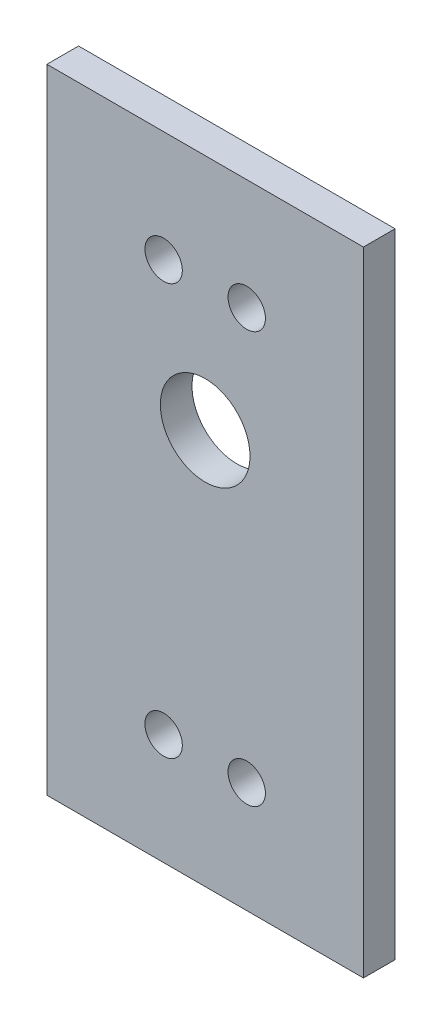
ISO-10303-21;
HEADER;
FILE_DESCRIPTION(('STEP AP214'),'2;1');
FILE_NAME('part.step','',(''),(''),'','','');
FILE_SCHEMA(('AUTOMOTIVE_DESIGN { 1 0 10303 214 1 1 1 1 }'));
ENDSEC;
DATA;
#1=APPLICATION_CONTEXT('core data for automotive mechanical design processes');
#2=APPLICATION_PROTOCOL_DEFINITION('international standard','automotive_design',2000,#1);
#3=PRODUCT_CONTEXT('',#1,'mechanical');
#4=PRODUCT('Part','Part','',(#3));
#5=PRODUCT_RELATED_PRODUCT_CATEGORY('part','',(#4));
#6=PRODUCT_DEFINITION_FORMATION('','',#4);
#7=PRODUCT_DEFINITION_CONTEXT('part definition',#1,'design');
#8=PRODUCT_DEFINITION('design','',#6,#7);
#9=PRODUCT_DEFINITION_SHAPE('','',#8);
#10=(LENGTH_UNIT() NAMED_UNIT(*) SI_UNIT(.MILLI.,.METRE.));
#11=(NAMED_UNIT(*) PLANE_ANGLE_UNIT() SI_UNIT($,.RADIAN.));
#12=(NAMED_UNIT(*) SI_UNIT($,.STERADIAN.) SOLID_ANGLE_UNIT());
#13=UNCERTAINTY_MEASURE_WITH_UNIT(LENGTH_MEASURE(1.E-05),#10,'distance_accuracy_value','');
#14=(GEOMETRIC_REPRESENTATION_CONTEXT(3) GLOBAL_UNCERTAINTY_ASSIGNED_CONTEXT((#13)) GLOBAL_UNIT_ASSIGNED_CONTEXT((#10,
#11,#12)) REPRESENTATION_CONTEXT('',''));
#15=CARTESIAN_POINT('',(0.,0.,0.));
#16=DIRECTION('',(0.,0.,1.));
#17=DIRECTION('',(1.,0.,0.));
#18=AXIS2_PLACEMENT_3D('',#15,#16,#17);
#19=CARTESIAN_POINT('',(19.05,38.1,3.81000000000001));
#20=DIRECTION('',(-1.,0.,0.));
#21=DIRECTION('',(0.,-1.,0.));
#22=AXIS2_PLACEMENT_3D('',#19,#20,#21);
#23=PLANE('',#22);
#24=DIRECTION('',(0.,1.,0.));
#25=VECTOR('',#24,1.);
#26=CARTESIAN_POINT('',(19.05,38.1,0.));
#27=LINE('',#26,#25);
#28=CARTESIAN_POINT('',(19.05,-38.0999999999999,0.));
#29=VERTEX_POINT('',#28);
#30=CARTESIAN_POINT('',(19.05,38.1,0.));
#31=VERTEX_POINT('',#30);
#32=EDGE_CURVE('E111',#29,#31,#27,.T.);
#33=ORIENTED_EDGE('',*,*,#32,.T.);
#34=DIRECTION('',(0.,0.,-1.));
#35=VECTOR('',#34,1.);
#36=CARTESIAN_POINT('',(19.05,38.1,3.81000000000001));
#37=LINE('',#36,#35);
#38=CARTESIAN_POINT('',(19.05,38.1,3.81000000000001));
#39=VERTEX_POINT('',#38);
#40=EDGE_CURVE('E13',#39,#31,#37,.T.);
#41=ORIENTED_EDGE('',*,*,#40,.F.);
#42=DIRECTION('',(0.,1.,0.));
#43=VECTOR('',#42,1.);
#44=CARTESIAN_POINT('',(19.05,38.1,3.81000000000001));
#45=LINE('',#44,#43);
#46=CARTESIAN_POINT('',(19.05,-38.0999999999999,3.80999999999999));
#47=VERTEX_POINT('',#46);
#48=EDGE_CURVE('E99',#47,#39,#45,.T.);
#49=ORIENTED_EDGE('',*,*,#48,.F.);
#50=DIRECTION('',(0.,0.,-1.));
#51=VECTOR('',#50,1.);
#52=CARTESIAN_POINT('',(19.05,-38.0999999999999,3.80999999999999));
#53=LINE('',#52,#51);
#54=EDGE_CURVE('E107',#47,#29,#53,.T.);
#55=ORIENTED_EDGE('',*,*,#54,.T.);
#56=EDGE_LOOP('',(#33,#41,#49,#55));
#57=FACE_BOUND('',#56,.T.);
#58=ADVANCED_FACE('F48',(#57),#23,.F.);
#59=CARTESIAN_POINT('',(-19.05,38.1,3.80999999999999));
#60=DIRECTION('',(0.,-1.,0.));
#61=DIRECTION('',(0.,0.,-1.));
#62=AXIS2_PLACEMENT_3D('',#59,#60,#61);
#63=PLANE('',#62);
#64=DIRECTION('',(-1.,0.,0.));
#65=VECTOR('',#64,1.);
#66=CARTESIAN_POINT('',(-19.05,38.1,0.));
#67=LINE('',#66,#65);
#68=CARTESIAN_POINT('',(-19.05,38.1,0.));
#69=VERTEX_POINT('',#68);
#70=EDGE_CURVE('E103',#31,#69,#67,.T.);
#71=ORIENTED_EDGE('',*,*,#70,.T.);
#72=DIRECTION('',(0.,0.,-1.));
#73=VECTOR('',#72,1.);
#74=CARTESIAN_POINT('',(-19.05,38.1,3.80999999999999));
#75=LINE('',#74,#73);
#76=CARTESIAN_POINT('',(-19.05,38.1,3.80999999999999));
#77=VERTEX_POINT('',#76);
#78=EDGE_CURVE('E56',#77,#69,#75,.T.);
#79=ORIENTED_EDGE('',*,*,#78,.F.);
#80=DIRECTION('',(-1.,0.,0.));
#81=VECTOR('',#80,1.);
#82=CARTESIAN_POINT('',(-19.05,38.1,3.80999999999999));
#83=LINE('',#82,#81);
#84=EDGE_CURVE('E94',#39,#77,#83,.T.);
#85=ORIENTED_EDGE('',*,*,#84,.F.);
#86=ORIENTED_EDGE('',*,*,#40,.T.);
#87=EDGE_LOOP('',(#71,#79,#85,#86));
#88=FACE_BOUND('',#87,.T.);
#89=ADVANCED_FACE('F102',(#88),#63,.F.);
#90=CARTESIAN_POINT('',(-19.05,38.1,3.80999999999999));
#91=DIRECTION('',(1.,0.,0.));
#92=DIRECTION('',(0.,1.,0.));
#93=AXIS2_PLACEMENT_3D('',#90,#91,#92);
#94=PLANE('',#93);
#95=DIRECTION('',(0.,-1.,0.));
#96=VECTOR('',#95,1.);
#97=CARTESIAN_POINT('',(-19.05,38.1,0.));
#98=LINE('',#97,#96);
#99=CARTESIAN_POINT('',(-19.05,-38.1,0.));
#100=VERTEX_POINT('',#99);
#101=EDGE_CURVE('E81',#69,#100,#98,.T.);
#102=ORIENTED_EDGE('',*,*,#101,.T.);
#103=DIRECTION('',(0.,0.,-1.));
#104=VECTOR('',#103,1.);
#105=CARTESIAN_POINT('',(-19.05,-38.1,3.81000000000004));
#106=LINE('',#105,#104);
#107=CARTESIAN_POINT('',(-19.05,-38.1,3.81000000000004));
#108=VERTEX_POINT('',#107);
#109=EDGE_CURVE('E104',#108,#100,#106,.T.);
#110=ORIENTED_EDGE('',*,*,#109,.F.);
#111=DIRECTION('',(0.,-1.,0.));
#112=VECTOR('',#111,1.);
#113=CARTESIAN_POINT('',(-19.05,38.1,3.80999999999999));
#114=LINE('',#113,#112);
#115=EDGE_CURVE('E97',#77,#108,#114,.T.);
#116=ORIENTED_EDGE('',*,*,#115,.F.);
#117=ORIENTED_EDGE('',*,*,#78,.T.);
#118=EDGE_LOOP('',(#102,#110,#116,#117));
#119=FACE_BOUND('',#118,.T.);
#120=ADVANCED_FACE('F105',(#119),#94,.F.);
#121=CARTESIAN_POINT('',(-19.05,-38.1,3.81000000000004));
#122=DIRECTION('',(0.,1.,0.));
#123=DIRECTION('',(0.,0.,1.));
#124=AXIS2_PLACEMENT_3D('',#121,#122,#123);
#125=PLANE('',#124);
#126=DIRECTION('',(1.,0.,0.));
#127=VECTOR('',#126,1.);
#128=CARTESIAN_POINT('',(-19.05,-38.1,0.));
#129=LINE('',#128,#127);
#130=EDGE_CURVE('E87',#100,#29,#129,.T.);
#131=ORIENTED_EDGE('',*,*,#130,.T.);
#132=ORIENTED_EDGE('',*,*,#54,.F.);
#133=DIRECTION('',(1.,0.,0.));
#134=VECTOR('',#133,1.);
#135=CARTESIAN_POINT('',(-19.05,-38.1,3.81000000000004));
#136=LINE('',#135,#134);
#137=EDGE_CURVE('E64',#108,#47,#136,.T.);
#138=ORIENTED_EDGE('',*,*,#137,.F.);
#139=ORIENTED_EDGE('',*,*,#109,.T.);
#140=EDGE_LOOP('',(#131,#132,#138,#139));
#141=FACE_BOUND('',#140,.T.);
#142=ADVANCED_FACE('F119',(#141),#125,.F.);
#143=CARTESIAN_POINT('',(0.,0.,3.80999999999999));
#144=DIRECTION('',(0.,0.,1.));
#145=DIRECTION('',(1.,0.,0.));
#146=AXIS2_PLACEMENT_3D('',#143,#144,#145);
#147=PLANE('',#146);
#148=CARTESIAN_POINT('',(0.,9.464,3.81000000000001));
#149=DIRECTION('',(0.,0.,1.));
#150=DIRECTION('',(1.,0.,0.));
#151=AXIS2_PLACEMENT_3D('',#148,#149,#150);
#152=CIRCLE('',#151,5.3975);
#153=CARTESIAN_POINT('',(5.3975,9.464,3.81000000000001));
#154=VERTEX_POINT('',#153);
#155=EDGE_CURVE('E151',#154,#154,#152,.T.);
#156=ORIENTED_EDGE('',*,*,#155,.F.);
#157=EDGE_LOOP('',(#156));
#158=FACE_BOUND('',#157,.T.);
#159=CARTESIAN_POINT('',(-5.,24.75,3.81000000000004));
#160=DIRECTION('',(0.,0.,1.));
#161=DIRECTION('',(1.,0.,0.));
#162=AXIS2_PLACEMENT_3D('',#159,#160,#161);
#163=CIRCLE('',#162,2.25);
#164=CARTESIAN_POINT('',(-2.75,24.75,3.81000000000004));
#165=VERTEX_POINT('',#164);
#166=EDGE_CURVE('E145',#165,#165,#163,.T.);
#167=ORIENTED_EDGE('',*,*,#166,.F.);
#168=EDGE_LOOP('',(#167));
#169=FACE_BOUND('',#168,.T.);
#170=CARTESIAN_POINT('',(5.,24.75,3.81000000000001));
#171=DIRECTION('',(0.,0.,1.));
#172=DIRECTION('',(1.,0.,0.));
#173=AXIS2_PLACEMENT_3D('',#170,#171,#172);
#174=CIRCLE('',#173,2.25);
#175=CARTESIAN_POINT('',(7.25,24.75,3.81000000000001));
#176=VERTEX_POINT('',#175);
#177=EDGE_CURVE('E139',#176,#176,#174,.T.);
#178=ORIENTED_EDGE('',*,*,#177,.F.);
#179=EDGE_LOOP('',(#178));
#180=FACE_BOUND('',#179,.T.);
#181=CARTESIAN_POINT('',(-5.,-24.75,3.81000000000004));
#182=DIRECTION('',(0.,0.,1.));
#183=DIRECTION('',(1.,0.,0.));
#184=AXIS2_PLACEMENT_3D('',#181,#182,#183);
#185=CIRCLE('',#184,2.25);
#186=CARTESIAN_POINT('',(-2.75,-24.75,3.81000000000004));
#187=VERTEX_POINT('',#186);
#188=EDGE_CURVE('E133',#187,#187,#185,.T.);
#189=ORIENTED_EDGE('',*,*,#188,.F.);
#190=EDGE_LOOP('',(#189));
#191=FACE_BOUND('',#190,.T.);
#192=CARTESIAN_POINT('',(5.,-24.75,3.81000000000001));
#193=DIRECTION('',(0.,0.,1.));
#194=DIRECTION('',(1.,0.,0.));
#195=AXIS2_PLACEMENT_3D('',#192,#193,#194);
#196=CIRCLE('',#195,2.25);
#197=CARTESIAN_POINT('',(7.25,-24.75,3.81000000000001));
#198=VERTEX_POINT('',#197);
#199=EDGE_CURVE('E127',#198,#198,#196,.T.);
#200=ORIENTED_EDGE('',*,*,#199,.F.);
#201=EDGE_LOOP('',(#200));
#202=FACE_BOUND('',#201,.T.);
#203=ORIENTED_EDGE('',*,*,#48,.T.);
#204=ORIENTED_EDGE('',*,*,#84,.T.);
#205=ORIENTED_EDGE('',*,*,#115,.T.);
#206=ORIENTED_EDGE('',*,*,#137,.T.);
#207=EDGE_LOOP('',(#203,#204,#205,#206));
#208=FACE_BOUND('',#207,.T.);
#209=ADVANCED_FACE('F95',(#158,#169,#180,#191,#202,#208),#147,.T.);
#210=CARTESIAN_POINT('',(0.,0.,0.));
#211=DIRECTION('',(0.,0.,1.));
#212=DIRECTION('',(1.,0.,0.));
#213=AXIS2_PLACEMENT_3D('',#210,#211,#212);
#214=PLANE('',#213);
#215=CARTESIAN_POINT('',(0.,9.464,0.));
#216=DIRECTION('',(0.,0.,1.));
#217=DIRECTION('',(1.,0.,0.));
#218=AXIS2_PLACEMENT_3D('',#215,#216,#217);
#219=CIRCLE('',#218,5.3975);
#220=CARTESIAN_POINT('',(5.3975,9.464,0.));
#221=VERTEX_POINT('',#220);
#222=EDGE_CURVE('E148',#221,#221,#219,.F.);
#223=ORIENTED_EDGE('',*,*,#222,.F.);
#224=EDGE_LOOP('',(#223));
#225=FACE_BOUND('',#224,.T.);
#226=CARTESIAN_POINT('',(-5.,24.75,0.));
#227=DIRECTION('',(0.,0.,1.));
#228=DIRECTION('',(1.,0.,0.));
#229=AXIS2_PLACEMENT_3D('',#226,#227,#228);
#230=CIRCLE('',#229,2.25);
#231=CARTESIAN_POINT('',(-2.75,24.75,0.));
#232=VERTEX_POINT('',#231);
#233=EDGE_CURVE('E142',#232,#232,#230,.T.);
#234=ORIENTED_EDGE('',*,*,#233,.T.);
#235=EDGE_LOOP('',(#234));
#236=FACE_BOUND('',#235,.T.);
#237=CARTESIAN_POINT('',(5.,24.75,0.));
#238=DIRECTION('',(0.,0.,1.));
#239=DIRECTION('',(1.,0.,0.));
#240=AXIS2_PLACEMENT_3D('',#237,#238,#239);
#241=CIRCLE('',#240,2.25);
#242=CARTESIAN_POINT('',(7.25,24.75,0.));
#243=VERTEX_POINT('',#242);
#244=EDGE_CURVE('E136',#243,#243,#241,.T.);
#245=ORIENTED_EDGE('',*,*,#244,.T.);
#246=EDGE_LOOP('',(#245));
#247=FACE_BOUND('',#246,.T.);
#248=CARTESIAN_POINT('',(-5.,-24.75,0.));
#249=DIRECTION('',(0.,0.,1.));
#250=DIRECTION('',(1.,0.,0.));
#251=AXIS2_PLACEMENT_3D('',#248,#249,#250);
#252=CIRCLE('',#251,2.25);
#253=CARTESIAN_POINT('',(-2.75,-24.75,0.));
#254=VERTEX_POINT('',#253);
#255=EDGE_CURVE('E130',#254,#254,#252,.T.);
#256=ORIENTED_EDGE('',*,*,#255,.T.);
#257=EDGE_LOOP('',(#256));
#258=FACE_BOUND('',#257,.T.);
#259=CARTESIAN_POINT('',(5.,-24.75,0.));
#260=DIRECTION('',(0.,0.,1.));
#261=DIRECTION('',(1.,0.,0.));
#262=AXIS2_PLACEMENT_3D('',#259,#260,#261);
#263=CIRCLE('',#262,2.25);
#264=CARTESIAN_POINT('',(7.25,-24.75,0.));
#265=VERTEX_POINT('',#264);
#266=EDGE_CURVE('E114',#265,#265,#263,.T.);
#267=ORIENTED_EDGE('',*,*,#266,.T.);
#268=EDGE_LOOP('',(#267));
#269=FACE_BOUND('',#268,.T.);
#270=ORIENTED_EDGE('',*,*,#32,.F.);
#271=ORIENTED_EDGE('',*,*,#130,.F.);
#272=ORIENTED_EDGE('',*,*,#101,.F.);
#273=ORIENTED_EDGE('',*,*,#70,.F.);
#274=EDGE_LOOP('',(#270,#271,#272,#273));
#275=FACE_BOUND('',#274,.T.);
#276=ADVANCED_FACE('F122',(#225,#236,#247,#258,#269,#275),#214,.F.);
#277=CARTESIAN_POINT('',(5.,-24.75,3.81000000000001));
#278=DIRECTION('',(0.,0.,1.));
#279=DIRECTION('',(1.,0.,0.));
#280=AXIS2_PLACEMENT_3D('',#277,#278,#279);
#281=CYLINDRICAL_SURFACE('',#280,2.25);
#282=ORIENTED_EDGE('',*,*,#266,.F.);
#283=EDGE_LOOP('',(#282));
#284=FACE_BOUND('',#283,.T.);
#285=ORIENTED_EDGE('',*,*,#199,.T.);
#286=EDGE_LOOP('',(#285));
#287=FACE_BOUND('',#286,.T.);
#288=ADVANCED_FACE('F169',(#284,#287),#281,.F.);
#289=CARTESIAN_POINT('',(-5.,-24.75,3.81000000000004));
#290=DIRECTION('',(0.,0.,1.));
#291=DIRECTION('',(1.,0.,0.));
#292=AXIS2_PLACEMENT_3D('',#289,#290,#291);
#293=CYLINDRICAL_SURFACE('',#292,2.25);
#294=ORIENTED_EDGE('',*,*,#255,.F.);
#295=EDGE_LOOP('',(#294));
#296=FACE_BOUND('',#295,.T.);
#297=ORIENTED_EDGE('',*,*,#188,.T.);
#298=EDGE_LOOP('',(#297));
#299=FACE_BOUND('',#298,.T.);
#300=ADVANCED_FACE('F171',(#296,#299),#293,.F.);
#301=CARTESIAN_POINT('',(5.,24.75,3.81000000000001));
#302=DIRECTION('',(0.,0.,1.));
#303=DIRECTION('',(1.,0.,0.));
#304=AXIS2_PLACEMENT_3D('',#301,#302,#303);
#305=CYLINDRICAL_SURFACE('',#304,2.25);
#306=ORIENTED_EDGE('',*,*,#244,.F.);
#307=EDGE_LOOP('',(#306));
#308=FACE_BOUND('',#307,.T.);
#309=ORIENTED_EDGE('',*,*,#177,.T.);
#310=EDGE_LOOP('',(#309));
#311=FACE_BOUND('',#310,.T.);
#312=ADVANCED_FACE('F178',(#308,#311),#305,.F.);
#313=CARTESIAN_POINT('',(-5.,24.75,3.81000000000004));
#314=DIRECTION('',(0.,0.,1.));
#315=DIRECTION('',(1.,0.,0.));
#316=AXIS2_PLACEMENT_3D('',#313,#314,#315);
#317=CYLINDRICAL_SURFACE('',#316,2.25);
#318=ORIENTED_EDGE('',*,*,#233,.F.);
#319=EDGE_LOOP('',(#318));
#320=FACE_BOUND('',#319,.T.);
#321=ORIENTED_EDGE('',*,*,#166,.T.);
#322=EDGE_LOOP('',(#321));
#323=FACE_BOUND('',#322,.T.);
#324=ADVANCED_FACE('F219',(#320,#323),#317,.F.);
#325=CARTESIAN_POINT('',(0.,9.464,-0.001000000000001));
#326=DIRECTION('',(0.,0.,1.));
#327=DIRECTION('',(1.,0.,0.));
#328=AXIS2_PLACEMENT_3D('',#325,#326,#327);
#329=CYLINDRICAL_SURFACE('',#328,5.3975);
#330=ORIENTED_EDGE('',*,*,#155,.T.);
#331=EDGE_LOOP('',(#330));
#332=FACE_BOUND('',#331,.T.);
#333=ORIENTED_EDGE('',*,*,#222,.T.);
#334=EDGE_LOOP('',(#333));
#335=FACE_BOUND('',#334,.T.);
#336=ADVANCED_FACE('F155',(#332,#335),#329,.F.);
#337=CLOSED_SHELL('',(#58,#89,#120,#142,#209,#276,#288,#300,#312,#324,#336));
#338=MANIFOLD_SOLID_BREP('B2',#337);
#339=ADVANCED_BREP_SHAPE_REPRESENTATION('',(#18,#338),#14);
#340=SHAPE_DEFINITION_REPRESENTATION(#9,#339);
ENDSEC;
END-ISO-10303-21;
